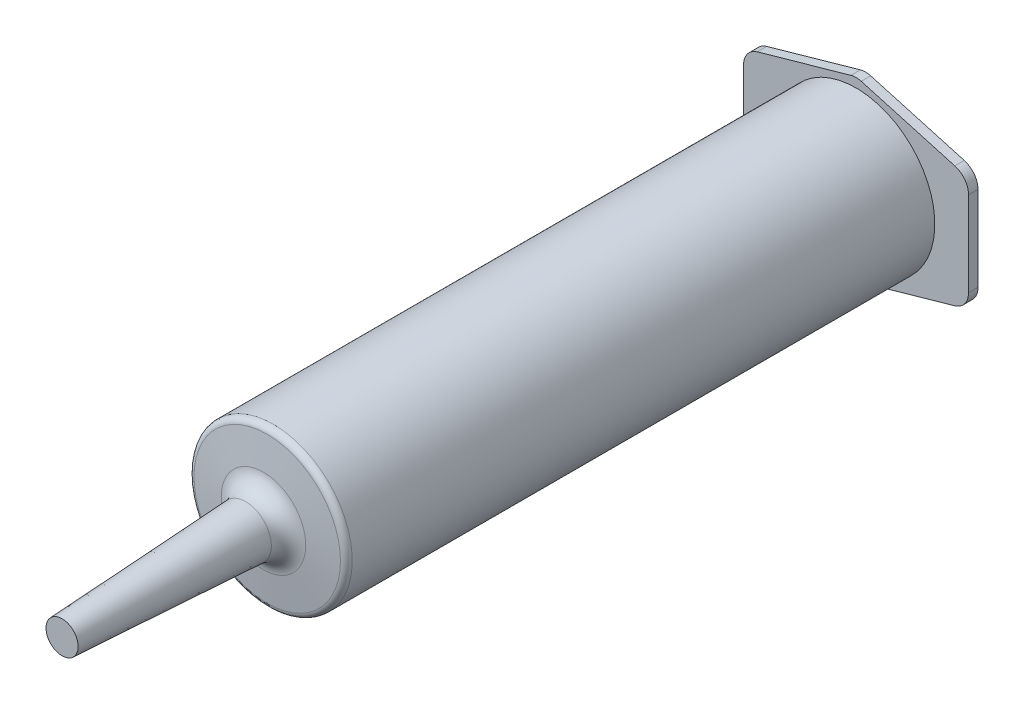
ISO-10303-21;
HEADER;
FILE_DESCRIPTION(('STEP AP214'),'2;1');
FILE_NAME('part.step','',(''),(''),'','','');
FILE_SCHEMA(('AUTOMOTIVE_DESIGN { 1 0 10303 214 1 1 1 1 }'));
ENDSEC;
DATA;
#1=APPLICATION_CONTEXT('core data for automotive mechanical design processes');
#2=APPLICATION_PROTOCOL_DEFINITION('international standard','automotive_design',2000,#1);
#3=PRODUCT_CONTEXT('',#1,'mechanical');
#4=PRODUCT('Part','Part','',(#3));
#5=PRODUCT_RELATED_PRODUCT_CATEGORY('part','',(#4));
#6=PRODUCT_DEFINITION_FORMATION('','',#4);
#7=PRODUCT_DEFINITION_CONTEXT('part definition',#1,'design');
#8=PRODUCT_DEFINITION('design','',#6,#7);
#9=PRODUCT_DEFINITION_SHAPE('','',#8);
#10=(LENGTH_UNIT() NAMED_UNIT(*) SI_UNIT(.MILLI.,.METRE.));
#11=(NAMED_UNIT(*) PLANE_ANGLE_UNIT() SI_UNIT($,.RADIAN.));
#12=(NAMED_UNIT(*) SI_UNIT($,.STERADIAN.) SOLID_ANGLE_UNIT());
#13=UNCERTAINTY_MEASURE_WITH_UNIT(LENGTH_MEASURE(1.E-05),#10,'distance_accuracy_value','');
#14=(GEOMETRIC_REPRESENTATION_CONTEXT(3) GLOBAL_UNCERTAINTY_ASSIGNED_CONTEXT((#13)) GLOBAL_UNIT_ASSIGNED_CONTEXT((#10,
#11,#12)) REPRESENTATION_CONTEXT('',''));
#15=CARTESIAN_POINT('',(0.,0.,0.));
#16=DIRECTION('',(0.,0.,1.));
#17=DIRECTION('',(1.,0.,0.));
#18=AXIS2_PLACEMENT_3D('',#15,#16,#17);
#19=CARTESIAN_POINT('',(0.16328571428569,0.,-117.815178571429));
#20=DIRECTION('',(0.,0.,-1.));
#21=DIRECTION('',(-1.,0.,0.));
#22=AXIS2_PLACEMENT_3D('',#19,#20,#21);
#23=PLANE('',#22);
#24=CARTESIAN_POINT('',(0.16328571428569,0.,-117.815178571429));
#25=DIRECTION('',(0.,0.,-1.));
#26=DIRECTION('',(-1.,0.,0.));
#27=AXIS2_PLACEMENT_3D('',#24,#25,#26);
#28=CIRCLE('',#27,13.97);
#29=CARTESIAN_POINT('',(-13.8067142857143,0.,-117.815178571429));
#30=VERTEX_POINT('',#29);
#31=EDGE_CURVE('E176',#30,#30,#28,.F.);
#32=ORIENTED_EDGE('',*,*,#31,.T.);
#33=EDGE_LOOP('',(#32));
#34=FACE_BOUND('',#33,.T.);
#35=DIRECTION('',(-0.962232692465649,-0.272228296747983,0.));
#36=VECTOR('',#35,1.);
#37=CARTESIAN_POINT('',(-4.66194988687663,16.4783773229205,-117.815178571429));
#38=LINE('',#37,#36);
#39=CARTESIAN_POINT('',(-0.873904096324112,17.5500653476986,-117.815178571429));
#40=VERTEX_POINT('',#39);
#41=CARTESIAN_POINT('',(-19.7334040963242,12.2144645073625,-117.815178571429));
#42=VERTEX_POINT('',#41);
#43=EDGE_CURVE('E146',#40,#42,#38,.T.);
#44=ORIENTED_EDGE('',*,*,#43,.F.);
#45=CARTESIAN_POINT('',(0.163285714285702,13.8839587894045,-117.815178571429));
#46=DIRECTION('',(0.,0.,-1.));
#47=DIRECTION('',(-1.,0.,0.));
#48=AXIS2_PLACEMENT_3D('',#45,#46,#47);
#49=CIRCLE('',#48,3.81);
#50=CARTESIAN_POINT('',(1.20047552489552,17.5500653476986,-117.815178571429));
#51=VERTEX_POINT('',#50);
#52=EDGE_CURVE('E129',#40,#51,#49,.T.);
#53=ORIENTED_EDGE('',*,*,#52,.T.);
#54=DIRECTION('',(0.962232692465649,-0.272228296747983,0.));
#55=VECTOR('',#54,1.);
#56=CARTESIAN_POINT('',(4.68615152249492,16.5639217181257,-117.815178571429));
#57=LINE('',#56,#55);
#58=CARTESIAN_POINT('',(20.0599755248956,12.2144645073625,-117.815178571429));
#59=VERTEX_POINT('',#58);
#60=EDGE_CURVE('E155',#51,#59,#57,.T.);
#61=ORIENTED_EDGE('',*,*,#60,.T.);
#62=CARTESIAN_POINT('',(19.0227857142858,8.54835794906836,-117.815178571429));
#63=DIRECTION('',(0.,0.,-1.));
#64=DIRECTION('',(-1.,0.,0.));
#65=AXIS2_PLACEMENT_3D('',#62,#63,#64);
#66=CIRCLE('',#65,3.81);
#67=CARTESIAN_POINT('',(22.8327857142858,8.54835794906836,-117.815178571429));
#68=VERTEX_POINT('',#67);
#69=EDGE_CURVE('E140',#59,#68,#66,.T.);
#70=ORIENTED_EDGE('',*,*,#69,.T.);
#71=DIRECTION('',(0.,1.,0.));
#72=VECTOR('',#71,1.);
#73=CARTESIAN_POINT('',(22.8327857142858,0.,-117.815178571429));
#74=LINE('',#73,#72);
#75=CARTESIAN_POINT('',(22.8327857142858,-8.54835794906836,-117.815178571429));
#76=VERTEX_POINT('',#75);
#77=EDGE_CURVE('E157',#76,#68,#74,.T.);
#78=ORIENTED_EDGE('',*,*,#77,.F.);
#79=CARTESIAN_POINT('',(19.0227857142858,-8.54835794906836,-117.815178571429));
#80=DIRECTION('',(0.,0.,-1.));
#81=DIRECTION('',(-1.,0.,0.));
#82=AXIS2_PLACEMENT_3D('',#79,#80,#81);
#83=CIRCLE('',#82,3.81);
#84=CARTESIAN_POINT('',(20.0599755248956,-12.2144645073625,-117.815178571429));
#85=VERTEX_POINT('',#84);
#86=EDGE_CURVE('E202',#76,#85,#83,.T.);
#87=ORIENTED_EDGE('',*,*,#86,.T.);
#88=DIRECTION('',(0.962232692465649,0.272228296747983,0.));
#89=VECTOR('',#88,1.);
#90=CARTESIAN_POINT('',(4.68615152249492,-16.5639217181257,-117.815178571429));
#91=LINE('',#90,#89);
#92=CARTESIAN_POINT('',(1.20047552489552,-17.5500653476986,-117.815178571429));
#93=VERTEX_POINT('',#92);
#94=EDGE_CURVE('E164',#93,#85,#91,.T.);
#95=ORIENTED_EDGE('',*,*,#94,.F.);
#96=CARTESIAN_POINT('',(0.163285714285701,-13.8839587894045,-117.815178571429));
#97=DIRECTION('',(0.,0.,-1.));
#98=DIRECTION('',(-1.,0.,0.));
#99=AXIS2_PLACEMENT_3D('',#96,#97,#98);
#100=CIRCLE('',#99,3.81);
#101=CARTESIAN_POINT('',(-0.873904096324113,-17.5500653476986,-117.815178571429));
#102=VERTEX_POINT('',#101);
#103=EDGE_CURVE('E200',#93,#102,#100,.T.);
#104=ORIENTED_EDGE('',*,*,#103,.T.);
#105=DIRECTION('',(-0.962232692465649,0.272228296747983,0.));
#106=VECTOR('',#105,1.);
#107=CARTESIAN_POINT('',(-4.66194988687663,-16.4783773229205,-117.815178571429));
#108=LINE('',#107,#106);
#109=CARTESIAN_POINT('',(-19.7334040963242,-12.2144645073625,-117.815178571429));
#110=VERTEX_POINT('',#109);
#111=EDGE_CURVE('E167',#102,#110,#108,.T.);
#112=ORIENTED_EDGE('',*,*,#111,.T.);
#113=CARTESIAN_POINT('',(-18.6962142857144,-8.54835794906836,-117.815178571429));
#114=DIRECTION('',(0.,0.,-1.));
#115=DIRECTION('',(-1.,0.,0.));
#116=AXIS2_PLACEMENT_3D('',#113,#114,#115);
#117=CIRCLE('',#116,3.81);
#118=CARTESIAN_POINT('',(-22.5062142857144,-8.54835794906836,-117.815178571429));
#119=VERTEX_POINT('',#118);
#120=EDGE_CURVE('E150',#110,#119,#117,.T.);
#121=ORIENTED_EDGE('',*,*,#120,.T.);
#122=DIRECTION('',(0.,1.,0.));
#123=VECTOR('',#122,1.);
#124=CARTESIAN_POINT('',(-22.5062142857144,0.,-117.815178571429));
#125=LINE('',#124,#123);
#126=CARTESIAN_POINT('',(-22.5062142857144,8.54835794906836,-117.815178571429));
#127=VERTEX_POINT('',#126);
#128=EDGE_CURVE('E170',#119,#127,#125,.T.);
#129=ORIENTED_EDGE('',*,*,#128,.T.);
#130=CARTESIAN_POINT('',(-18.6962142857144,8.54835794906836,-117.815178571429));
#131=DIRECTION('',(0.,0.,-1.));
#132=DIRECTION('',(-1.,0.,0.));
#133=AXIS2_PLACEMENT_3D('',#130,#131,#132);
#134=CIRCLE('',#133,3.81);
#135=EDGE_CURVE('E154',#127,#42,#134,.T.);
#136=ORIENTED_EDGE('',*,*,#135,.T.);
#137=EDGE_LOOP('',(#44,#53,#61,#70,#78,#87,#95,#104,#112,#121,#129,#136));
#138=FACE_BOUND('',#137,.T.);
#139=ADVANCED_FACE('F38',(#34,#138),#23,.T.);
#140=CARTESIAN_POINT('',(0.16328571428569,0.,44.1098214285714));
#141=DIRECTION('',(0.,0.,1.));
#142=DIRECTION('',(1.,0.,0.));
#143=AXIS2_PLACEMENT_3D('',#140,#141,#142);
#144=CYLINDRICAL_SURFACE('',#143,13.97);
#145=ORIENTED_EDGE('',*,*,#31,.F.);
#146=EDGE_LOOP('',(#145));
#147=FACE_BOUND('',#146,.T.);
#148=CARTESIAN_POINT('',(0.16328571428569,0.,0.942362925668062));
#149=DIRECTION('',(0.,0.,-1.));
#150=DIRECTION('',(-1.,0.,0.));
#151=AXIS2_PLACEMENT_3D('',#148,#149,#150);
#152=CIRCLE('',#151,13.97);
#153=CARTESIAN_POINT('',(-13.8067142857143,0.,0.942362925668062));
#154=VERTEX_POINT('',#153);
#155=EDGE_CURVE('E173',#154,#154,#152,.F.);
#156=ORIENTED_EDGE('',*,*,#155,.T.);
#157=EDGE_LOOP('',(#156));
#158=FACE_BOUND('',#157,.T.);
#159=ADVANCED_FACE('F253',(#147,#158),#144,.F.);
#160=CARTESIAN_POINT('',(0.16328571428569,0.,2.01029908968155));
#161=DIRECTION('',(0.,0.,-1.));
#162=DIRECTION('',(-1.,0.,0.));
#163=AXIS2_PLACEMENT_3D('',#160,#161,#162);
#164=CONICAL_SURFACE('',#163,5.10612983868798,1.45089234142987);
#165=CARTESIAN_POINT('',(0.16328571428569,0.,1.62689248089306));
#166=DIRECTION('',(0.,0.,-1.));
#167=DIRECTION('',(-1.,0.,0.));
#168=AXIS2_PLACEMENT_3D('',#165,#166,#167);
#169=CIRCLE('',#168,8.28840469163251);
#170=CARTESIAN_POINT('',(-8.12511897734682,0.,1.62689248089306));
#171=VERTEX_POINT('',#170);
#172=EDGE_CURVE('E178',#171,#171,#169,.T.);
#173=ORIENTED_EDGE('',*,*,#172,.F.);
#174=EDGE_LOOP('',(#173));
#175=FACE_BOUND('',#174,.T.);
#176=ORIENTED_EDGE('',*,*,#155,.F.);
#177=EDGE_LOOP('',(#176));
#178=FACE_BOUND('',#177,.T.);
#179=ADVANCED_FACE('F259',(#175,#178),#164,.F.);
#180=CARTESIAN_POINT('',(0.16328571428569,0.,44.0106745561048));
#181=DIRECTION('',(0.,0.,-1.));
#182=DIRECTION('',(-1.,0.,0.));
#183=AXIS2_PLACEMENT_3D('',#180,#181,#182);
#184=CONICAL_SURFACE('',#183,1.3360818289135,0.0520691274066168);
#185=CARTESIAN_POINT('',(0.16328571428569,0.,7.00341888016268));
#186=DIRECTION('',(0.,0.,-1.));
#187=DIRECTION('',(-1.,0.,0.));
#188=AXIS2_PLACEMENT_3D('',#185,#186,#187);
#189=CIRCLE('',#188,3.2647606623091);
#190=CARTESIAN_POINT('',(-3.1014749480234,0.,7.00341888016268));
#191=VERTEX_POINT('',#190);
#192=EDGE_CURVE('E182',#191,#191,#189,.F.);
#193=ORIENTED_EDGE('',*,*,#192,.F.);
#194=EDGE_LOOP('',(#193));
#195=FACE_BOUND('',#194,.T.);
#196=CARTESIAN_POINT('',(0.16328571428569,0.,42.2048214285714));
#197=DIRECTION('',(0.,0.,1.));
#198=DIRECTION('',(1.,0.,0.));
#199=AXIS2_PLACEMENT_3D('',#196,#197,#198);
#200=CIRCLE('',#199,1.43019609487781);
#201=CARTESIAN_POINT('',(1.59348180916351,0.,42.2048214285714));
#202=VERTEX_POINT('',#201);
#203=EDGE_CURVE('E177',#202,#202,#200,.T.);
#204=ORIENTED_EDGE('',*,*,#203,.T.);
#205=EDGE_LOOP('',(#204));
#206=FACE_BOUND('',#205,.T.);
#207=ADVANCED_FACE('F340',(#195,#206),#184,.F.);
#208=CARTESIAN_POINT('',(3.40178571428569,0.,42.2048214285714));
#209=DIRECTION('',(0.,0.,1.));
#210=DIRECTION('',(1.,0.,0.));
#211=AXIS2_PLACEMENT_3D('',#208,#209,#210);
#212=PLANE('',#211);
#213=ORIENTED_EDGE('',*,*,#203,.F.);
#214=EDGE_LOOP('',(#213));
#215=FACE_BOUND('',#214,.T.);
#216=ADVANCED_FACE('F336',(#215),#212,.F.);
#217=CARTESIAN_POINT('',(0.16328571428569,0.,7.30085949756249));
#218=DIRECTION('',(0.,0.,1.));
#219=DIRECTION('',(1.,0.,0.));
#220=AXIS2_PLACEMENT_3D('',#217,#218,#219);
#221=TOROIDAL_SURFACE('',#220,8.97201517556858,5.715);
#222=ORIENTED_EDGE('',*,*,#172,.T.);
#223=EDGE_LOOP('',(#222));
#224=FACE_BOUND('',#223,.T.);
#225=ORIENTED_EDGE('',*,*,#192,.T.);
#226=EDGE_LOOP('',(#225));
#227=FACE_BOUND('',#226,.T.);
#228=ADVANCED_FACE('F333',(#224,#227),#221,.T.);
#229=CARTESIAN_POINT('',(-4.66194988687663,16.4783773229205,-115.910178571429));
#230=DIRECTION('',(0.272228296747983,-0.962232692465649,0.));
#231=DIRECTION('',(0.962232692465649,0.272228296747983,0.));
#232=AXIS2_PLACEMENT_3D('',#229,#230,#231);
#233=PLANE('',#232);
#234=DIRECTION('',(-0.962232692465649,-0.272228296747983,0.));
#235=VECTOR('',#234,1.);
#236=CARTESIAN_POINT('',(-4.66194988687663,16.4783773229205,-115.910178571429));
#237=LINE('',#236,#235);
#238=CARTESIAN_POINT('',(-0.873904096324112,17.5500653476986,-115.910178571429));
#239=VERTEX_POINT('',#238);
#240=CARTESIAN_POINT('',(-19.7334040963242,12.2144645073625,-115.910178571429));
#241=VERTEX_POINT('',#240);
#242=EDGE_CURVE('E149',#239,#241,#237,.T.);
#243=ORIENTED_EDGE('',*,*,#242,.F.);
#244=DIRECTION('',(0.,0.,-1.));
#245=VECTOR('',#244,1.);
#246=CARTESIAN_POINT('',(-0.873904096324114,17.5500653476986,-117.815178571429));
#247=LINE('',#246,#245);
#248=EDGE_CURVE('E133',#239,#40,#247,.T.);
#249=ORIENTED_EDGE('',*,*,#248,.T.);
#250=ORIENTED_EDGE('',*,*,#43,.T.);
#251=DIRECTION('',(0.,0.,-1.));
#252=VECTOR('',#251,1.);
#253=CARTESIAN_POINT('',(-19.7334040963242,12.2144645073625,-115.910178571429));
#254=LINE('',#253,#252);
#255=EDGE_CURVE('E151',#42,#241,#254,.F.);
#256=ORIENTED_EDGE('',*,*,#255,.T.);
#257=EDGE_LOOP('',(#243,#249,#250,#256));
#258=FACE_BOUND('',#257,.T.);
#259=ADVANCED_FACE('F145',(#258),#233,.F.);
#260=CARTESIAN_POINT('',(-22.5062142857144,0.,-115.910178571429));
#261=DIRECTION('',(-1.,0.,0.));
#262=DIRECTION('',(0.,0.,1.));
#263=AXIS2_PLACEMENT_3D('',#260,#261,#262);
#264=PLANE('',#263);
#265=DIRECTION('',(0.,1.,0.));
#266=VECTOR('',#265,1.);
#267=CARTESIAN_POINT('',(-22.5062142857144,0.,-115.910178571429));
#268=LINE('',#267,#266);
#269=CARTESIAN_POINT('',(-22.5062142857144,-8.54835794906836,-115.910178571429));
#270=VERTEX_POINT('',#269);
#271=CARTESIAN_POINT('',(-22.5062142857144,8.54835794906836,-115.910178571429));
#272=VERTEX_POINT('',#271);
#273=EDGE_CURVE('E160',#270,#272,#268,.T.);
#274=ORIENTED_EDGE('',*,*,#273,.T.);
#275=DIRECTION('',(0.,0.,-1.));
#276=VECTOR('',#275,1.);
#277=CARTESIAN_POINT('',(-22.5062142857144,8.54835794906836,-117.815178571429));
#278=LINE('',#277,#276);
#279=EDGE_CURVE('E235',#272,#127,#278,.T.);
#280=ORIENTED_EDGE('',*,*,#279,.T.);
#281=ORIENTED_EDGE('',*,*,#128,.F.);
#282=DIRECTION('',(0.,0.,-1.));
#283=VECTOR('',#282,1.);
#284=CARTESIAN_POINT('',(-22.5062142857144,-8.54835794906836,-115.910178571429));
#285=LINE('',#284,#283);
#286=EDGE_CURVE('E233',#119,#270,#285,.F.);
#287=ORIENTED_EDGE('',*,*,#286,.T.);
#288=EDGE_LOOP('',(#274,#280,#281,#287));
#289=FACE_BOUND('',#288,.T.);
#290=ADVANCED_FACE('F297',(#289),#264,.T.);
#291=CARTESIAN_POINT('',(-4.66194988687663,-16.4783773229205,-115.910178571429));
#292=DIRECTION('',(-0.272228296747983,-0.962232692465649,0.));
#293=DIRECTION('',(0.962232692465649,-0.272228296747983,0.));
#294=AXIS2_PLACEMENT_3D('',#291,#292,#293);
#295=PLANE('',#294);
#296=ORIENTED_EDGE('',*,*,#111,.F.);
#297=DIRECTION('',(0.,0.,-1.));
#298=VECTOR('',#297,1.);
#299=CARTESIAN_POINT('',(-0.873904096324114,-17.5500653476986,-115.910178571429));
#300=LINE('',#299,#298);
#301=CARTESIAN_POINT('',(-0.873904096324113,-17.5500653476986,-115.910178571429));
#302=VERTEX_POINT('',#301);
#303=EDGE_CURVE('E231',#102,#302,#300,.F.);
#304=ORIENTED_EDGE('',*,*,#303,.T.);
#305=DIRECTION('',(-0.962232692465649,0.272228296747983,0.));
#306=VECTOR('',#305,1.);
#307=CARTESIAN_POINT('',(-4.66194988687663,-16.4783773229205,-115.910178571429));
#308=LINE('',#307,#306);
#309=CARTESIAN_POINT('',(-19.7334040963242,-12.2144645073625,-115.910178571429));
#310=VERTEX_POINT('',#309);
#311=EDGE_CURVE('E300',#302,#310,#308,.T.);
#312=ORIENTED_EDGE('',*,*,#311,.T.);
#313=DIRECTION('',(0.,0.,-1.));
#314=VECTOR('',#313,1.);
#315=CARTESIAN_POINT('',(-19.7334040963242,-12.2144645073625,-115.910178571429));
#316=LINE('',#315,#314);
#317=EDGE_CURVE('E228',#310,#110,#316,.T.);
#318=ORIENTED_EDGE('',*,*,#317,.T.);
#319=EDGE_LOOP('',(#296,#304,#312,#318));
#320=FACE_BOUND('',#319,.T.);
#321=ADVANCED_FACE('F360',(#320),#295,.T.);
#322=CARTESIAN_POINT('',(4.68615152249492,-16.5639217181257,-115.910178571429));
#323=DIRECTION('',(-0.272228296747983,0.962232692465649,0.));
#324=DIRECTION('',(-0.962232692465649,-0.272228296747983,0.));
#325=AXIS2_PLACEMENT_3D('',#322,#323,#324);
#326=PLANE('',#325);
#327=ORIENTED_EDGE('',*,*,#94,.T.);
#328=DIRECTION('',(0.,0.,-1.));
#329=VECTOR('',#328,1.);
#330=CARTESIAN_POINT('',(20.0599755248956,-12.2144645073625,-115.910178571429));
#331=LINE('',#330,#329);
#332=CARTESIAN_POINT('',(20.0599755248956,-12.2144645073625,-115.910178571429));
#333=VERTEX_POINT('',#332);
#334=EDGE_CURVE('E226',#85,#333,#331,.F.);
#335=ORIENTED_EDGE('',*,*,#334,.T.);
#336=DIRECTION('',(0.962232692465649,0.272228296747983,0.));
#337=VECTOR('',#336,1.);
#338=CARTESIAN_POINT('',(4.68615152249492,-16.5639217181257,-115.910178571429));
#339=LINE('',#338,#337);
#340=CARTESIAN_POINT('',(1.20047552489552,-17.5500653476986,-115.910178571429));
#341=VERTEX_POINT('',#340);
#342=EDGE_CURVE('E302',#341,#333,#339,.T.);
#343=ORIENTED_EDGE('',*,*,#342,.F.);
#344=DIRECTION('',(0.,0.,-1.));
#345=VECTOR('',#344,1.);
#346=CARTESIAN_POINT('',(1.20047552489552,-17.5500653476986,-117.815178571429));
#347=LINE('',#346,#345);
#348=EDGE_CURVE('E223',#341,#93,#347,.T.);
#349=ORIENTED_EDGE('',*,*,#348,.T.);
#350=EDGE_LOOP('',(#327,#335,#343,#349));
#351=FACE_BOUND('',#350,.T.);
#352=ADVANCED_FACE('F357',(#351),#326,.F.);
#353=CARTESIAN_POINT('',(22.8327857142858,0.,-115.910178571429));
#354=DIRECTION('',(-1.,0.,0.));
#355=DIRECTION('',(0.,0.,1.));
#356=AXIS2_PLACEMENT_3D('',#353,#354,#355);
#357=PLANE('',#356);
#358=ORIENTED_EDGE('',*,*,#77,.T.);
#359=DIRECTION('',(0.,0.,-1.));
#360=VECTOR('',#359,1.);
#361=CARTESIAN_POINT('',(22.8327857142858,8.54835794906836,-115.910178571429));
#362=LINE('',#361,#360);
#363=CARTESIAN_POINT('',(22.8327857142858,8.54835794906836,-115.910178571429));
#364=VERTEX_POINT('',#363);
#365=EDGE_CURVE('E53',#68,#364,#362,.F.);
#366=ORIENTED_EDGE('',*,*,#365,.T.);
#367=DIRECTION('',(0.,1.,0.));
#368=VECTOR('',#367,1.);
#369=CARTESIAN_POINT('',(22.8327857142858,0.,-115.910178571429));
#370=LINE('',#369,#368);
#371=CARTESIAN_POINT('',(22.8327857142858,-8.54835794906836,-115.910178571429));
#372=VERTEX_POINT('',#371);
#373=EDGE_CURVE('E306',#372,#364,#370,.T.);
#374=ORIENTED_EDGE('',*,*,#373,.F.);
#375=DIRECTION('',(0.,0.,-1.));
#376=VECTOR('',#375,1.);
#377=CARTESIAN_POINT('',(22.8327857142858,-8.54835794906836,-115.910178571429));
#378=LINE('',#377,#376);
#379=EDGE_CURVE('E219',#372,#76,#378,.T.);
#380=ORIENTED_EDGE('',*,*,#379,.T.);
#381=EDGE_LOOP('',(#358,#366,#374,#380));
#382=FACE_BOUND('',#381,.T.);
#383=ADVANCED_FACE('F353',(#382),#357,.F.);
#384=CARTESIAN_POINT('',(4.68615152249492,16.5639217181257,-115.910178571429));
#385=DIRECTION('',(0.272228296747983,0.962232692465649,0.));
#386=DIRECTION('',(-0.962232692465649,0.272228296747983,0.));
#387=AXIS2_PLACEMENT_3D('',#384,#385,#386);
#388=PLANE('',#387);
#389=ORIENTED_EDGE('',*,*,#60,.F.);
#390=DIRECTION('',(0.,0.,-1.));
#391=VECTOR('',#390,1.);
#392=CARTESIAN_POINT('',(1.20047552489552,17.5500653476986,-115.910178571429));
#393=LINE('',#392,#391);
#394=CARTESIAN_POINT('',(1.20047552489552,17.5500653476986,-115.910178571429));
#395=VERTEX_POINT('',#394);
#396=EDGE_CURVE('E134',#51,#395,#393,.F.);
#397=ORIENTED_EDGE('',*,*,#396,.T.);
#398=DIRECTION('',(0.962232692465649,-0.272228296747983,0.));
#399=VECTOR('',#398,1.);
#400=CARTESIAN_POINT('',(4.68615152249492,16.5639217181257,-115.910178571429));
#401=LINE('',#400,#399);
#402=CARTESIAN_POINT('',(20.0599755248956,12.2144645073625,-115.910178571429));
#403=VERTEX_POINT('',#402);
#404=EDGE_CURVE('E310',#395,#403,#401,.T.);
#405=ORIENTED_EDGE('',*,*,#404,.T.);
#406=DIRECTION('',(0.,0.,-1.));
#407=VECTOR('',#406,1.);
#408=CARTESIAN_POINT('',(20.0599755248956,12.2144645073625,-117.815178571429));
#409=LINE('',#408,#407);
#410=EDGE_CURVE('E139',#403,#59,#409,.T.);
#411=ORIENTED_EDGE('',*,*,#410,.T.);
#412=EDGE_LOOP('',(#389,#397,#405,#411));
#413=FACE_BOUND('',#412,.T.);
#414=ADVANCED_FACE('F350',(#413),#388,.T.);
#415=CARTESIAN_POINT('',(0.,0.,-115.910178571429));
#416=DIRECTION('',(0.,0.,-1.));
#417=DIRECTION('',(-1.,0.,0.));
#418=AXIS2_PLACEMENT_3D('',#415,#416,#417);
#419=PLANE('',#418);
#420=CARTESIAN_POINT('',(0.16328571428569,0.,-115.910178571429));
#421=DIRECTION('',(0.,0.,-1.));
#422=DIRECTION('',(-1.,0.,0.));
#423=AXIS2_PLACEMENT_3D('',#420,#421,#422);
#424=CIRCLE('',#423,15.875);
#425=CARTESIAN_POINT('',(-15.7117142857143,0.,-115.910178571429));
#426=VERTEX_POINT('',#425);
#427=EDGE_CURVE('E172',#426,#426,#424,.T.);
#428=ORIENTED_EDGE('',*,*,#427,.T.);
#429=EDGE_LOOP('',(#428));
#430=FACE_BOUND('',#429,.T.);
#431=ORIENTED_EDGE('',*,*,#404,.F.);
#432=CARTESIAN_POINT('',(0.163285714285702,13.8839587894045,-115.910178571429));
#433=DIRECTION('',(0.,0.,-1.));
#434=DIRECTION('',(-1.,0.,0.));
#435=AXIS2_PLACEMENT_3D('',#432,#433,#434);
#436=CIRCLE('',#435,3.81);
#437=EDGE_CURVE('E217',#395,#239,#436,.F.);
#438=ORIENTED_EDGE('',*,*,#437,.T.);
#439=ORIENTED_EDGE('',*,*,#242,.T.);
#440=CARTESIAN_POINT('',(-18.6962142857144,8.54835794906836,-115.910178571429));
#441=DIRECTION('',(0.,0.,-1.));
#442=DIRECTION('',(-1.,0.,0.));
#443=AXIS2_PLACEMENT_3D('',#440,#441,#442);
#444=CIRCLE('',#443,3.81);
#445=EDGE_CURVE('E210',#241,#272,#444,.F.);
#446=ORIENTED_EDGE('',*,*,#445,.T.);
#447=ORIENTED_EDGE('',*,*,#273,.F.);
#448=CARTESIAN_POINT('',(-18.6962142857144,-8.54835794906836,-115.910178571429));
#449=DIRECTION('',(0.,0.,-1.));
#450=DIRECTION('',(-1.,0.,0.));
#451=AXIS2_PLACEMENT_3D('',#448,#449,#450);
#452=CIRCLE('',#451,3.81);
#453=EDGE_CURVE('E208',#270,#310,#452,.F.);
#454=ORIENTED_EDGE('',*,*,#453,.T.);
#455=ORIENTED_EDGE('',*,*,#311,.F.);
#456=CARTESIAN_POINT('',(0.163285714285701,-13.8839587894045,-115.910178571429));
#457=DIRECTION('',(0.,0.,-1.));
#458=DIRECTION('',(-1.,0.,0.));
#459=AXIS2_PLACEMENT_3D('',#456,#457,#458);
#460=CIRCLE('',#459,3.81);
#461=EDGE_CURVE('E212',#302,#341,#460,.F.);
#462=ORIENTED_EDGE('',*,*,#461,.T.);
#463=ORIENTED_EDGE('',*,*,#342,.T.);
#464=CARTESIAN_POINT('',(19.0227857142858,-8.54835794906836,-115.910178571429));
#465=DIRECTION('',(0.,0.,-1.));
#466=DIRECTION('',(-1.,0.,0.));
#467=AXIS2_PLACEMENT_3D('',#464,#465,#466);
#468=CIRCLE('',#467,3.81);
#469=EDGE_CURVE('E60',#333,#372,#468,.F.);
#470=ORIENTED_EDGE('',*,*,#469,.T.);
#471=ORIENTED_EDGE('',*,*,#373,.T.);
#472=CARTESIAN_POINT('',(19.0227857142858,8.54835794906836,-115.910178571429));
#473=DIRECTION('',(0.,0.,-1.));
#474=DIRECTION('',(-1.,0.,0.));
#475=AXIS2_PLACEMENT_3D('',#472,#473,#474);
#476=CIRCLE('',#475,3.81);
#477=EDGE_CURVE('E215',#364,#403,#476,.F.);
#478=ORIENTED_EDGE('',*,*,#477,.T.);
#479=EDGE_LOOP('',(#431,#438,#439,#446,#447,#454,#455,#462,#463,#470,#471,#478));
#480=FACE_BOUND('',#479,.T.);
#481=ADVANCED_FACE('F294',(#430,#480),#419,.F.);
#482=CARTESIAN_POINT('',(3.40178571428569,0.,44.1098214285714));
#483=DIRECTION('',(0.,0.,1.));
#484=DIRECTION('',(1.,0.,0.));
#485=AXIS2_PLACEMENT_3D('',#482,#483,#484);
#486=PLANE('',#485);
#487=CARTESIAN_POINT('',(0.16328571428569,0.,44.1098214285714));
#488=DIRECTION('',(0.,0.,1.));
#489=DIRECTION('',(1.,0.,0.));
#490=AXIS2_PLACEMENT_3D('',#487,#488,#489);
#491=CIRCLE('',#490,3.2385);
#492=CARTESIAN_POINT('',(3.40178571428569,0.,44.1098214285714));
#493=VERTEX_POINT('',#492);
#494=EDGE_CURVE('E181',#493,#493,#491,.T.);
#495=ORIENTED_EDGE('',*,*,#494,.T.);
#496=EDGE_LOOP('',(#495));
#497=FACE_BOUND('',#496,.T.);
#498=ADVANCED_FACE('F328',(#497),#486,.T.);
#499=CARTESIAN_POINT('',(0.16328571428569,0.,44.1098214285714));
#500=DIRECTION('',(0.,0.,-1.));
#501=DIRECTION('',(-1.,0.,0.));
#502=AXIS2_PLACEMENT_3D('',#499,#500,#501);
#503=CONICAL_SURFACE('',#502,3.2385,0.0520691274066168);
#504=CARTESIAN_POINT('',(0.16328571428569,0.,7.10256575262928));
#505=DIRECTION('',(0.,0.,-1.));
#506=DIRECTION('',(-1.,0.,0.));
#507=AXIS2_PLACEMENT_3D('',#504,#505,#506);
#508=CIRCLE('',#507,5.16717883339559);
#509=CARTESIAN_POINT('',(-5.0038931191099,0.,7.10256575262928));
#510=VERTEX_POINT('',#509);
#511=EDGE_CURVE('E191',#510,#510,#508,.F.);
#512=ORIENTED_EDGE('',*,*,#511,.T.);
#513=EDGE_LOOP('',(#512));
#514=FACE_BOUND('',#513,.T.);
#515=ORIENTED_EDGE('',*,*,#494,.F.);
#516=EDGE_LOOP('',(#515));
#517=FACE_BOUND('',#516,.T.);
#518=ADVANCED_FACE('F269',(#514,#517),#503,.T.);
#519=CARTESIAN_POINT('',(0.16328571428569,0.,7.30085949756249));
#520=DIRECTION('',(0.,0.,1.));
#521=DIRECTION('',(1.,0.,0.));
#522=AXIS2_PLACEMENT_3D('',#519,#520,#521);
#523=TOROIDAL_SURFACE('',#522,8.97201517556858,3.81);
#524=CARTESIAN_POINT('',(0.16328571428569,0.,3.51821481978287));
#525=DIRECTION('',(0.,0.,-1.));
#526=DIRECTION('',(-1.,0.,0.));
#527=AXIS2_PLACEMENT_3D('',#524,#525,#526);
#528=CIRCLE('',#527,8.51627485294454);
#529=CARTESIAN_POINT('',(-8.35298913865885,0.,3.51821481978287));
#530=VERTEX_POINT('',#529);
#531=EDGE_CURVE('E194',#530,#530,#528,.T.);
#532=ORIENTED_EDGE('',*,*,#531,.F.);
#533=EDGE_LOOP('',(#532));
#534=FACE_BOUND('',#533,.T.);
#535=ORIENTED_EDGE('',*,*,#511,.F.);
#536=EDGE_LOOP('',(#535));
#537=FACE_BOUND('',#536,.T.);
#538=ADVANCED_FACE('F266',(#534,#537),#523,.F.);
#539=CARTESIAN_POINT('',(0.16328571428569,0.,3.90162142857137));
#540=DIRECTION('',(0.,0.,-1.));
#541=DIRECTION('',(-1.,0.,0.));
#542=AXIS2_PLACEMENT_3D('',#539,#540,#541);
#543=CONICAL_SURFACE('',#542,5.334,1.45089234142987);
#544=CARTESIAN_POINT('',(0.16328571428569,0.,2.76633065256237));
#545=DIRECTION('',(0.,0.,1.));
#546=DIRECTION('',(1.,0.,0.));
#547=AXIS2_PLACEMENT_3D('',#544,#545,#546);
#548=CIRCLE('',#547,14.7569134408747);
#549=CARTESIAN_POINT('',(14.9201991551604,0.,2.76633065256237));
#550=VERTEX_POINT('',#549);
#551=EDGE_CURVE('E46',#550,#550,#548,.T.);
#552=ORIENTED_EDGE('',*,*,#551,.T.);
#553=EDGE_LOOP('',(#552));
#554=FACE_BOUND('',#553,.T.);
#555=ORIENTED_EDGE('',*,*,#531,.T.);
#556=EDGE_LOOP('',(#555));
#557=FACE_BOUND('',#556,.T.);
#558=ADVANCED_FACE('F240',(#554,#557),#543,.T.);
#559=CARTESIAN_POINT('',(0.16328571428569,0.,44.1098214285714));
#560=DIRECTION('',(0.,0.,1.));
#561=DIRECTION('',(1.,0.,0.));
#562=AXIS2_PLACEMENT_3D('',#559,#560,#561);
#563=CYLINDRICAL_SURFACE('',#562,15.875);
#564=CARTESIAN_POINT('',(0.16328571428569,0.,1.5054490933025));
#565=DIRECTION('',(0.,0.,-1.));
#566=DIRECTION('',(-1.,0.,0.));
#567=AXIS2_PLACEMENT_3D('',#564,#565,#566);
#568=CIRCLE('',#567,15.875);
#569=CARTESIAN_POINT('',(-15.7117142857143,0.,1.5054490933025));
#570=VERTEX_POINT('',#569);
#571=EDGE_CURVE('E11',#570,#570,#568,.T.);
#572=ORIENTED_EDGE('',*,*,#571,.T.);
#573=EDGE_LOOP('',(#572));
#574=FACE_BOUND('',#573,.T.);
#575=ORIENTED_EDGE('',*,*,#427,.F.);
#576=EDGE_LOOP('',(#575));
#577=FACE_BOUND('',#576,.T.);
#578=ADVANCED_FACE('F264',(#574,#577),#563,.T.);
#579=CARTESIAN_POINT('',(0.163285714285702,13.8839587894045,-115.910178571429));
#580=DIRECTION('',(0.,0.,1.));
#581=DIRECTION('',(1.,0.,0.));
#582=AXIS2_PLACEMENT_3D('',#579,#580,#581);
#583=CYLINDRICAL_SURFACE('',#582,3.81);
#584=ORIENTED_EDGE('',*,*,#437,.F.);
#585=ORIENTED_EDGE('',*,*,#396,.F.);
#586=ORIENTED_EDGE('',*,*,#52,.F.);
#587=ORIENTED_EDGE('',*,*,#248,.F.);
#588=EDGE_LOOP('',(#584,#585,#586,#587));
#589=FACE_BOUND('',#588,.T.);
#590=ADVANCED_FACE('F132',(#589),#583,.T.);
#591=CARTESIAN_POINT('',(19.0227857142858,8.54835794906836,-115.910178571429));
#592=DIRECTION('',(0.,0.,1.));
#593=DIRECTION('',(1.,0.,0.));
#594=AXIS2_PLACEMENT_3D('',#591,#592,#593);
#595=CYLINDRICAL_SURFACE('',#594,3.81);
#596=ORIENTED_EDGE('',*,*,#477,.F.);
#597=ORIENTED_EDGE('',*,*,#365,.F.);
#598=ORIENTED_EDGE('',*,*,#69,.F.);
#599=ORIENTED_EDGE('',*,*,#410,.F.);
#600=EDGE_LOOP('',(#596,#597,#598,#599));
#601=FACE_BOUND('',#600,.T.);
#602=ADVANCED_FACE('F273',(#601),#595,.T.);
#603=CARTESIAN_POINT('',(19.0227857142858,-8.54835794906836,-115.910178571429));
#604=DIRECTION('',(0.,0.,-1.));
#605=DIRECTION('',(-1.,0.,0.));
#606=AXIS2_PLACEMENT_3D('',#603,#604,#605);
#607=CYLINDRICAL_SURFACE('',#606,3.81);
#608=ORIENTED_EDGE('',*,*,#469,.F.);
#609=ORIENTED_EDGE('',*,*,#334,.F.);
#610=ORIENTED_EDGE('',*,*,#86,.F.);
#611=ORIENTED_EDGE('',*,*,#379,.F.);
#612=EDGE_LOOP('',(#608,#609,#610,#611));
#613=FACE_BOUND('',#612,.T.);
#614=ADVANCED_FACE('F276',(#613),#607,.T.);
#615=CARTESIAN_POINT('',(0.163285714285701,-13.8839587894045,-115.910178571429));
#616=DIRECTION('',(0.,0.,1.));
#617=DIRECTION('',(1.,0.,0.));
#618=AXIS2_PLACEMENT_3D('',#615,#616,#617);
#619=CYLINDRICAL_SURFACE('',#618,3.81);
#620=ORIENTED_EDGE('',*,*,#461,.F.);
#621=ORIENTED_EDGE('',*,*,#303,.F.);
#622=ORIENTED_EDGE('',*,*,#103,.F.);
#623=ORIENTED_EDGE('',*,*,#348,.F.);
#624=EDGE_LOOP('',(#620,#621,#622,#623));
#625=FACE_BOUND('',#624,.T.);
#626=ADVANCED_FACE('F280',(#625),#619,.T.);
#627=CARTESIAN_POINT('',(-18.6962142857144,8.54835794906836,-115.910178571429));
#628=DIRECTION('',(0.,0.,1.));
#629=DIRECTION('',(1.,0.,0.));
#630=AXIS2_PLACEMENT_3D('',#627,#628,#629);
#631=CYLINDRICAL_SURFACE('',#630,3.81);
#632=ORIENTED_EDGE('',*,*,#445,.F.);
#633=ORIENTED_EDGE('',*,*,#255,.F.);
#634=ORIENTED_EDGE('',*,*,#135,.F.);
#635=ORIENTED_EDGE('',*,*,#279,.F.);
#636=EDGE_LOOP('',(#632,#633,#634,#635));
#637=FACE_BOUND('',#636,.T.);
#638=ADVANCED_FACE('F249',(#637),#631,.T.);
#639=CARTESIAN_POINT('',(-18.6962142857144,-8.54835794906836,-115.910178571429));
#640=DIRECTION('',(0.,0.,-1.));
#641=DIRECTION('',(-1.,0.,0.));
#642=AXIS2_PLACEMENT_3D('',#639,#640,#641);
#643=CYLINDRICAL_SURFACE('',#642,3.81);
#644=ORIENTED_EDGE('',*,*,#453,.F.);
#645=ORIENTED_EDGE('',*,*,#286,.F.);
#646=ORIENTED_EDGE('',*,*,#120,.F.);
#647=ORIENTED_EDGE('',*,*,#317,.F.);
#648=EDGE_LOOP('',(#644,#645,#646,#647));
#649=FACE_BOUND('',#648,.T.);
#650=ADVANCED_FACE('F244',(#649),#643,.T.);
#651=CARTESIAN_POINT('',(0.16328571428569,0.,1.5054490933025));
#652=DIRECTION('',(0.,0.,-1.));
#653=DIRECTION('',(-1.,0.,0.));
#654=AXIS2_PLACEMENT_3D('',#651,#652,#653);
#655=TOROIDAL_SURFACE('',#654,14.605,1.27);
#656=ORIENTED_EDGE('',*,*,#571,.F.);
#657=EDGE_LOOP('',(#656));
#658=FACE_BOUND('',#657,.T.);
#659=ORIENTED_EDGE('',*,*,#551,.F.);
#660=EDGE_LOOP('',(#659));
#661=FACE_BOUND('',#660,.T.);
#662=ADVANCED_FACE('F40',(#658,#661),#655,.T.);
#663=CLOSED_SHELL('',(#139,#159,#179,#207,#216,#228,#259,#290,#321,#352,#383,#414,#481,#498,
#518,#538,#558,#578,#590,#602,#614,#626,#638,#650,#662));
#664=MANIFOLD_SOLID_BREP('B2',#663);
#665=ADVANCED_BREP_SHAPE_REPRESENTATION('',(#18,#664),#14);
#666=SHAPE_DEFINITION_REPRESENTATION(#9,#665);
ENDSEC;
END-ISO-10303-21;
